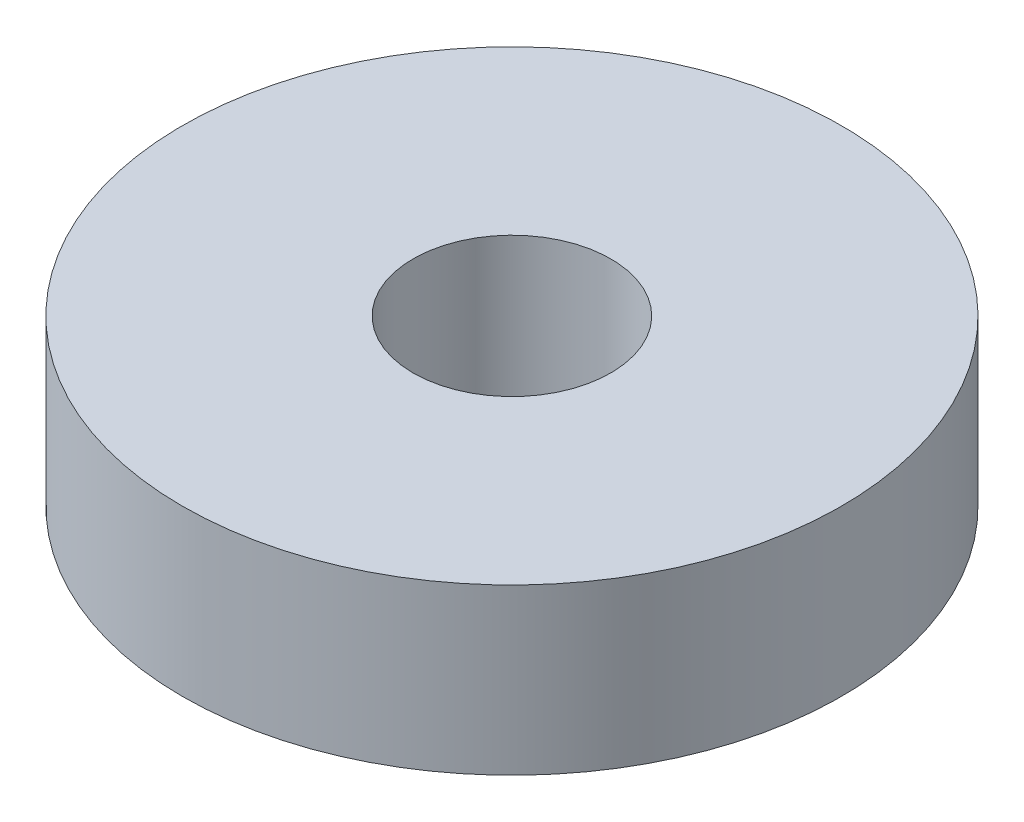
ISO-10303-21;
HEADER;
FILE_DESCRIPTION(('STEP AP214'),'2;1');
FILE_NAME('part.step','',(''),(''),'','','');
FILE_SCHEMA(('AUTOMOTIVE_DESIGN { 1 0 10303 214 1 1 1 1 }'));
ENDSEC;
DATA;
#1=APPLICATION_CONTEXT('core data for automotive mechanical design processes');
#2=APPLICATION_PROTOCOL_DEFINITION('international standard','automotive_design',2000,#1);
#3=PRODUCT_CONTEXT('',#1,'mechanical');
#4=PRODUCT('Part','Part','',(#3));
#5=PRODUCT_RELATED_PRODUCT_CATEGORY('part','',(#4));
#6=PRODUCT_DEFINITION_FORMATION('','',#4);
#7=PRODUCT_DEFINITION_CONTEXT('part definition',#1,'design');
#8=PRODUCT_DEFINITION('design','',#6,#7);
#9=PRODUCT_DEFINITION_SHAPE('','',#8);
#10=(LENGTH_UNIT() NAMED_UNIT(*) SI_UNIT(.MILLI.,.METRE.));
#11=(NAMED_UNIT(*) PLANE_ANGLE_UNIT() SI_UNIT($,.RADIAN.));
#12=(NAMED_UNIT(*) SI_UNIT($,.STERADIAN.) SOLID_ANGLE_UNIT());
#13=UNCERTAINTY_MEASURE_WITH_UNIT(LENGTH_MEASURE(1.E-05),#10,'distance_accuracy_value','');
#14=(GEOMETRIC_REPRESENTATION_CONTEXT(3) GLOBAL_UNCERTAINTY_ASSIGNED_CONTEXT((#13)) GLOBAL_UNIT_ASSIGNED_CONTEXT((#10,
#11,#12)) REPRESENTATION_CONTEXT('',''));
#15=CARTESIAN_POINT('',(0.,0.,0.));
#16=DIRECTION('',(0.,0.,1.));
#17=DIRECTION('',(1.,0.,0.));
#18=AXIS2_PLACEMENT_3D('',#15,#16,#17);
#19=CARTESIAN_POINT('',(0.,5.,0.));
#20=DIRECTION('',(0.,-1.,0.));
#21=DIRECTION('',(0.,0.,-1.));
#22=AXIS2_PLACEMENT_3D('',#19,#20,#21);
#23=CYLINDRICAL_SURFACE('',#22,3.);
#24=CARTESIAN_POINT('',(0.,5.,0.));
#25=DIRECTION('',(0.,1.,0.));
#26=DIRECTION('',(0.,0.,1.));
#27=AXIS2_PLACEMENT_3D('',#24,#25,#26);
#28=CIRCLE('',#27,3.);
#29=CARTESIAN_POINT('',(0.,5.,3.));
#30=VERTEX_POINT('',#29);
#31=EDGE_CURVE('E42',#30,#30,#28,.T.);
#32=ORIENTED_EDGE('',*,*,#31,.T.);
#33=EDGE_LOOP('',(#32));
#34=FACE_BOUND('',#33,.T.);
#35=CARTESIAN_POINT('',(0.,0.,0.));
#36=DIRECTION('',(0.,1.,0.));
#37=DIRECTION('',(0.,0.,1.));
#38=AXIS2_PLACEMENT_3D('',#35,#36,#37);
#39=CIRCLE('',#38,3.);
#40=CARTESIAN_POINT('',(0.,0.,3.));
#41=VERTEX_POINT('',#40);
#42=EDGE_CURVE('E48',#41,#41,#39,.T.);
#43=ORIENTED_EDGE('',*,*,#42,.F.);
#44=EDGE_LOOP('',(#43));
#45=FACE_BOUND('',#44,.T.);
#46=ADVANCED_FACE('F35',(#34,#45),#23,.F.);
#47=CARTESIAN_POINT('',(0.,5.,0.));
#48=DIRECTION('',(0.,-1.,0.));
#49=DIRECTION('',(0.,0.,-1.));
#50=AXIS2_PLACEMENT_3D('',#47,#48,#49);
#51=CYLINDRICAL_SURFACE('',#50,10.);
#52=CARTESIAN_POINT('',(0.,5.,0.));
#53=DIRECTION('',(0.,1.,0.));
#54=DIRECTION('',(0.,0.,1.));
#55=AXIS2_PLACEMENT_3D('',#52,#53,#54);
#56=CIRCLE('',#55,10.);
#57=CARTESIAN_POINT('',(0.,5.,10.));
#58=VERTEX_POINT('',#57);
#59=EDGE_CURVE('E10',#58,#58,#56,.T.);
#60=ORIENTED_EDGE('',*,*,#59,.F.);
#61=EDGE_LOOP('',(#60));
#62=FACE_BOUND('',#61,.T.);
#63=CARTESIAN_POINT('',(0.,0.,0.));
#64=DIRECTION('',(0.,1.,0.));
#65=DIRECTION('',(0.,0.,1.));
#66=AXIS2_PLACEMENT_3D('',#63,#64,#65);
#67=CIRCLE('',#66,10.);
#68=CARTESIAN_POINT('',(0.,0.,10.));
#69=VERTEX_POINT('',#68);
#70=EDGE_CURVE('E38',#69,#69,#67,.T.);
#71=ORIENTED_EDGE('',*,*,#70,.T.);
#72=EDGE_LOOP('',(#71));
#73=FACE_BOUND('',#72,.T.);
#74=ADVANCED_FACE('F55',(#62,#73),#51,.T.);
#75=CARTESIAN_POINT('',(0.,5.,0.));
#76=DIRECTION('',(0.,1.,0.));
#77=DIRECTION('',(0.,0.,1.));
#78=AXIS2_PLACEMENT_3D('',#75,#76,#77);
#79=PLANE('',#78);
#80=ORIENTED_EDGE('',*,*,#31,.F.);
#81=EDGE_LOOP('',(#80));
#82=FACE_BOUND('',#81,.T.);
#83=ORIENTED_EDGE('',*,*,#59,.T.);
#84=EDGE_LOOP('',(#83));
#85=FACE_BOUND('',#84,.T.);
#86=ADVANCED_FACE('F59',(#82,#85),#79,.T.);
#87=CARTESIAN_POINT('',(0.,0.,0.));
#88=DIRECTION('',(0.,1.,0.));
#89=DIRECTION('',(0.,0.,1.));
#90=AXIS2_PLACEMENT_3D('',#87,#88,#89);
#91=PLANE('',#90);
#92=ORIENTED_EDGE('',*,*,#42,.T.);
#93=EDGE_LOOP('',(#92));
#94=FACE_BOUND('',#93,.T.);
#95=ORIENTED_EDGE('',*,*,#70,.F.);
#96=EDGE_LOOP('',(#95));
#97=FACE_BOUND('',#96,.T.);
#98=ADVANCED_FACE('F57',(#94,#97),#91,.F.);
#99=CLOSED_SHELL('',(#46,#74,#86,#98));
#100=MANIFOLD_SOLID_BREP('B2',#99);
#101=ADVANCED_BREP_SHAPE_REPRESENTATION('',(#18,#100),#14);
#102=SHAPE_DEFINITION_REPRESENTATION(#9,#101);
ENDSEC;
END-ISO-10303-21;
